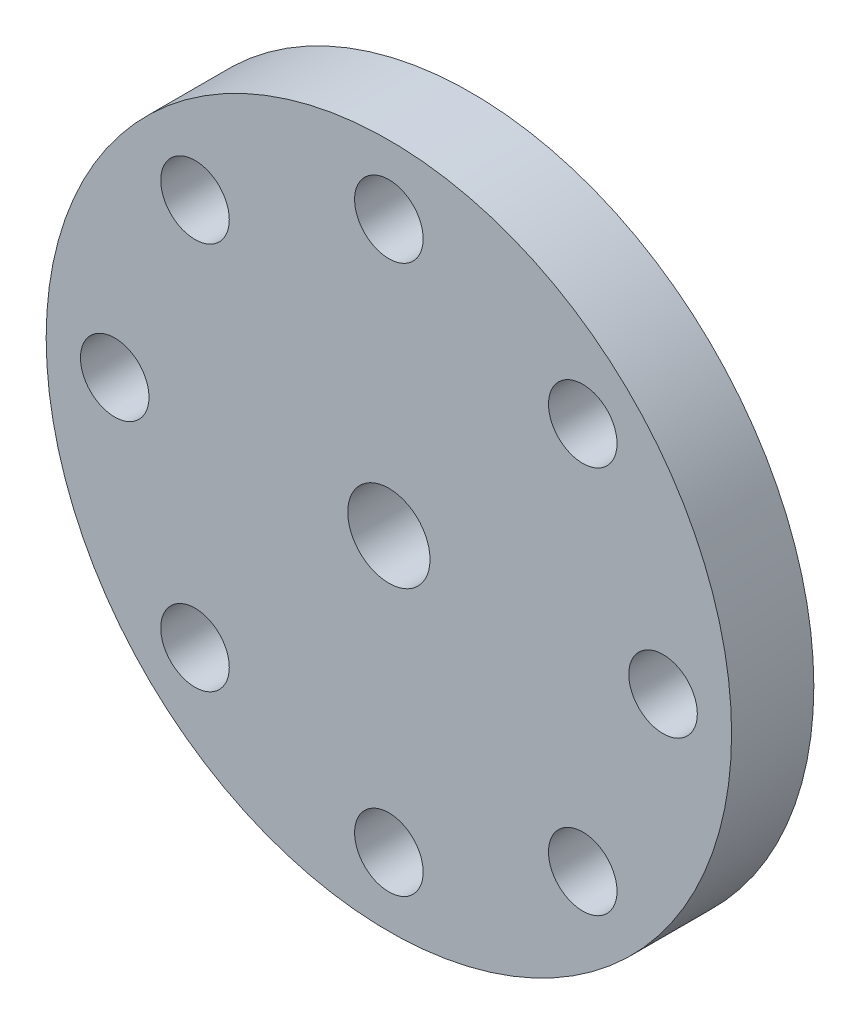
ISO-10303-21;
HEADER;
FILE_DESCRIPTION(('STEP AP214'),'2;1');
FILE_NAME('part.step','',(''),(''),'','','');
FILE_SCHEMA(('AUTOMOTIVE_DESIGN { 1 0 10303 214 1 1 1 1 }'));
ENDSEC;
DATA;
#1=APPLICATION_CONTEXT('core data for automotive mechanical design processes');
#2=APPLICATION_PROTOCOL_DEFINITION('international standard','automotive_design',2000,#1);
#3=PRODUCT_CONTEXT('',#1,'mechanical');
#4=PRODUCT('Part','Part','',(#3));
#5=PRODUCT_RELATED_PRODUCT_CATEGORY('part','',(#4));
#6=PRODUCT_DEFINITION_FORMATION('','',#4);
#7=PRODUCT_DEFINITION_CONTEXT('part definition',#1,'design');
#8=PRODUCT_DEFINITION('design','',#6,#7);
#9=PRODUCT_DEFINITION_SHAPE('','',#8);
#10=(LENGTH_UNIT() NAMED_UNIT(*) SI_UNIT(.MILLI.,.METRE.));
#11=(NAMED_UNIT(*) PLANE_ANGLE_UNIT() SI_UNIT($,.RADIAN.));
#12=(NAMED_UNIT(*) SI_UNIT($,.STERADIAN.) SOLID_ANGLE_UNIT());
#13=UNCERTAINTY_MEASURE_WITH_UNIT(LENGTH_MEASURE(1.E-05),#10,'distance_accuracy_value','');
#14=(GEOMETRIC_REPRESENTATION_CONTEXT(3) GLOBAL_UNCERTAINTY_ASSIGNED_CONTEXT((#13)) GLOBAL_UNIT_ASSIGNED_CONTEXT((#10,
#11,#12)) REPRESENTATION_CONTEXT('',''));
#15=CARTESIAN_POINT('',(0.,0.,0.));
#16=DIRECTION('',(0.,0.,1.));
#17=DIRECTION('',(1.,0.,0.));
#18=AXIS2_PLACEMENT_3D('',#15,#16,#17);
#19=CARTESIAN_POINT('',(0.,0.,3.));
#20=DIRECTION('',(0.,0.,-1.));
#21=DIRECTION('',(-1.,0.,0.));
#22=AXIS2_PLACEMENT_3D('',#19,#20,#21);
#23=CYLINDRICAL_SURFACE('',#22,1.5);
#24=CARTESIAN_POINT('',(0.,0.,3.));
#25=DIRECTION('',(0.,0.,1.));
#26=DIRECTION('',(1.,0.,0.));
#27=AXIS2_PLACEMENT_3D('',#24,#25,#26);
#28=CIRCLE('',#27,1.5);
#29=CARTESIAN_POINT('',(1.5,0.,3.));
#30=VERTEX_POINT('',#29);
#31=EDGE_CURVE('E53',#30,#30,#28,.T.);
#32=ORIENTED_EDGE('',*,*,#31,.T.);
#33=EDGE_LOOP('',(#32));
#34=FACE_BOUND('',#33,.T.);
#35=CARTESIAN_POINT('',(0.,0.,0.5));
#36=DIRECTION('',(0.,0.,-1.));
#37=DIRECTION('',(-1.,0.,0.));
#38=AXIS2_PLACEMENT_3D('',#35,#36,#37);
#39=CIRCLE('',#38,1.5);
#40=CARTESIAN_POINT('',(-1.5,0.,0.5));
#41=VERTEX_POINT('',#40);
#42=EDGE_CURVE('E104',#41,#41,#39,.T.);
#43=ORIENTED_EDGE('',*,*,#42,.T.);
#44=EDGE_LOOP('',(#43));
#45=FACE_BOUND('',#44,.T.);
#46=ADVANCED_FACE('F37',(#34,#45),#23,.F.);
#47=CARTESIAN_POINT('',(0.,0.,3.));
#48=DIRECTION('',(0.,0.,1.));
#49=DIRECTION('',(1.,0.,0.));
#50=AXIS2_PLACEMENT_3D('',#47,#48,#49);
#51=PLANE('',#50);
#52=CARTESIAN_POINT('',(-10.,1.04744440165294E-13,3.));
#53=DIRECTION('',(0.,0.,1.));
#54=DIRECTION('',(1.,0.,0.));
#55=AXIS2_PLACEMENT_3D('',#52,#53,#54);
#56=CIRCLE('',#55,1.25);
#57=CARTESIAN_POINT('',(-8.75,1.04744440165294E-13,3.));
#58=VERTEX_POINT('',#57);
#59=EDGE_CURVE('E86',#58,#58,#56,.T.);
#60=ORIENTED_EDGE('',*,*,#59,.F.);
#61=EDGE_LOOP('',(#60));
#62=FACE_BOUND('',#61,.T.);
#63=CARTESIAN_POINT('',(0.,-10.,3.));
#64=DIRECTION('',(0.,0.,1.));
#65=DIRECTION('',(1.,0.,0.));
#66=AXIS2_PLACEMENT_3D('',#63,#64,#65);
#67=CIRCLE('',#66,1.25);
#68=CARTESIAN_POINT('',(1.24999999999993,-10.,3.));
#69=VERTEX_POINT('',#68);
#70=EDGE_CURVE('E74',#69,#69,#67,.T.);
#71=ORIENTED_EDGE('',*,*,#70,.F.);
#72=EDGE_LOOP('',(#71));
#73=FACE_BOUND('',#72,.T.);
#74=CARTESIAN_POINT('',(10.,0.,3.));
#75=DIRECTION('',(0.,0.,1.));
#76=DIRECTION('',(1.,0.,0.));
#77=AXIS2_PLACEMENT_3D('',#74,#75,#76);
#78=CIRCLE('',#77,1.25);
#79=CARTESIAN_POINT('',(11.25,0.,3.));
#80=VERTEX_POINT('',#79);
#81=EDGE_CURVE('E62',#80,#80,#78,.T.);
#82=ORIENTED_EDGE('',*,*,#81,.F.);
#83=EDGE_LOOP('',(#82));
#84=FACE_BOUND('',#83,.T.);
#85=ORIENTED_EDGE('',*,*,#31,.F.);
#86=EDGE_LOOP('',(#85));
#87=FACE_BOUND('',#86,.T.);
#88=CARTESIAN_POINT('',(0.,0.,3.));
#89=DIRECTION('',(0.,0.,1.));
#90=DIRECTION('',(1.,0.,0.));
#91=AXIS2_PLACEMENT_3D('',#88,#89,#90);
#92=CIRCLE('',#91,12.5);
#93=CARTESIAN_POINT('',(12.5,0.,3.));
#94=VERTEX_POINT('',#93);
#95=EDGE_CURVE('E10',#94,#94,#92,.T.);
#96=ORIENTED_EDGE('',*,*,#95,.T.);
#97=EDGE_LOOP('',(#96));
#98=FACE_BOUND('',#97,.T.);
#99=CARTESIAN_POINT('',(0.,10.,3.));
#100=DIRECTION('',(0.,0.,1.));
#101=DIRECTION('',(1.,0.,0.));
#102=AXIS2_PLACEMENT_3D('',#99,#100,#101);
#103=CIRCLE('',#102,1.25);
#104=CARTESIAN_POINT('',(1.25,10.,3.));
#105=VERTEX_POINT('',#104);
#106=EDGE_CURVE('E48',#105,#105,#103,.T.);
#107=ORIENTED_EDGE('',*,*,#106,.F.);
#108=EDGE_LOOP('',(#107));
#109=FACE_BOUND('',#108,.T.);
#110=CARTESIAN_POINT('',(7.07106781186549,7.07106781186546,3.));
#111=DIRECTION('',(0.,0.,1.));
#112=DIRECTION('',(1.,0.,0.));
#113=AXIS2_PLACEMENT_3D('',#110,#111,#112);
#114=CIRCLE('',#113,1.25);
#115=CARTESIAN_POINT('',(8.32106781186549,7.07106781186546,3.));
#116=VERTEX_POINT('',#115);
#117=EDGE_CURVE('E58',#116,#116,#114,.T.);
#118=ORIENTED_EDGE('',*,*,#117,.F.);
#119=EDGE_LOOP('',(#118));
#120=FACE_BOUND('',#119,.T.);
#121=CARTESIAN_POINT('',(7.07106781186544,-7.07106781186551,3.));
#122=DIRECTION('',(0.,0.,1.));
#123=DIRECTION('',(1.,0.,0.));
#124=AXIS2_PLACEMENT_3D('',#121,#122,#123);
#125=CIRCLE('',#124,1.25);
#126=CARTESIAN_POINT('',(8.32106781186544,-7.07106781186551,3.));
#127=VERTEX_POINT('',#126);
#128=EDGE_CURVE('E68',#127,#127,#125,.T.);
#129=ORIENTED_EDGE('',*,*,#128,.F.);
#130=EDGE_LOOP('',(#129));
#131=FACE_BOUND('',#130,.T.);
#132=CARTESIAN_POINT('',(-7.07106781186554,-7.07106781186541,3.));
#133=DIRECTION('',(0.,0.,1.));
#134=DIRECTION('',(1.,0.,0.));
#135=AXIS2_PLACEMENT_3D('',#132,#133,#134);
#136=CIRCLE('',#135,1.25);
#137=CARTESIAN_POINT('',(-5.82106781186554,-7.07106781186541,3.));
#138=VERTEX_POINT('',#137);
#139=EDGE_CURVE('E80',#138,#138,#136,.T.);
#140=ORIENTED_EDGE('',*,*,#139,.F.);
#141=EDGE_LOOP('',(#140));
#142=FACE_BOUND('',#141,.T.);
#143=CARTESIAN_POINT('',(-7.07106781186539,7.07106781186556,3.));
#144=DIRECTION('',(0.,0.,1.));
#145=DIRECTION('',(1.,0.,0.));
#146=AXIS2_PLACEMENT_3D('',#143,#144,#145);
#147=CIRCLE('',#146,1.25);
#148=CARTESIAN_POINT('',(-5.82106781186539,7.07106781186556,3.));
#149=VERTEX_POINT('',#148);
#150=EDGE_CURVE('E92',#149,#149,#147,.T.);
#151=ORIENTED_EDGE('',*,*,#150,.F.);
#152=EDGE_LOOP('',(#151));
#153=FACE_BOUND('',#152,.T.);
#154=ADVANCED_FACE('F127',(#62,#73,#84,#87,#98,#109,#120,#131,#142,#153),#51,.T.);
#155=CARTESIAN_POINT('',(0.,0.,0.));
#156=DIRECTION('',(0.,0.,1.));
#157=DIRECTION('',(1.,0.,0.));
#158=AXIS2_PLACEMENT_3D('',#155,#156,#157);
#159=PLANE('',#158);
#160=CARTESIAN_POINT('',(0.,0.,0.));
#161=DIRECTION('',(0.,0.,-1.));
#162=DIRECTION('',(-1.,0.,0.));
#163=AXIS2_PLACEMENT_3D('',#160,#161,#162);
#164=CIRCLE('',#163,3.5);
#165=CARTESIAN_POINT('',(-3.5,0.,0.));
#166=VERTEX_POINT('',#165);
#167=EDGE_CURVE('E101',#166,#166,#164,.T.);
#168=ORIENTED_EDGE('',*,*,#167,.F.);
#169=EDGE_LOOP('',(#168));
#170=FACE_BOUND('',#169,.T.);
#171=CARTESIAN_POINT('',(0.,0.,0.));
#172=DIRECTION('',(0.,0.,1.));
#173=DIRECTION('',(1.,0.,0.));
#174=AXIS2_PLACEMENT_3D('',#171,#172,#173);
#175=CIRCLE('',#174,12.5);
#176=CARTESIAN_POINT('',(12.5,0.,0.));
#177=VERTEX_POINT('',#176);
#178=EDGE_CURVE('E41',#177,#177,#175,.T.);
#179=ORIENTED_EDGE('',*,*,#178,.F.);
#180=EDGE_LOOP('',(#179));
#181=FACE_BOUND('',#180,.T.);
#182=CARTESIAN_POINT('',(0.,10.,0.));
#183=DIRECTION('',(0.,0.,1.));
#184=DIRECTION('',(1.,0.,0.));
#185=AXIS2_PLACEMENT_3D('',#182,#183,#184);
#186=CIRCLE('',#185,1.25);
#187=CARTESIAN_POINT('',(1.25,10.,0.));
#188=VERTEX_POINT('',#187);
#189=EDGE_CURVE('E50',#188,#188,#186,.T.);
#190=ORIENTED_EDGE('',*,*,#189,.T.);
#191=EDGE_LOOP('',(#190));
#192=FACE_BOUND('',#191,.T.);
#193=CARTESIAN_POINT('',(7.07106781186549,7.07106781186546,0.));
#194=DIRECTION('',(0.,0.,1.));
#195=DIRECTION('',(1.,0.,0.));
#196=AXIS2_PLACEMENT_3D('',#193,#194,#195);
#197=CIRCLE('',#196,1.25);
#198=CARTESIAN_POINT('',(8.32106781186549,7.07106781186546,0.));
#199=VERTEX_POINT('',#198);
#200=EDGE_CURVE('E59',#199,#199,#197,.T.);
#201=ORIENTED_EDGE('',*,*,#200,.T.);
#202=EDGE_LOOP('',(#201));
#203=FACE_BOUND('',#202,.T.);
#204=CARTESIAN_POINT('',(10.,0.,0.));
#205=DIRECTION('',(0.,0.,1.));
#206=DIRECTION('',(1.,0.,0.));
#207=AXIS2_PLACEMENT_3D('',#204,#205,#206);
#208=CIRCLE('',#207,1.25);
#209=CARTESIAN_POINT('',(11.25,0.,0.));
#210=VERTEX_POINT('',#209);
#211=EDGE_CURVE('E65',#210,#210,#208,.T.);
#212=ORIENTED_EDGE('',*,*,#211,.T.);
#213=EDGE_LOOP('',(#212));
#214=FACE_BOUND('',#213,.T.);
#215=CARTESIAN_POINT('',(7.07106781186544,-7.07106781186551,0.));
#216=DIRECTION('',(0.,0.,1.));
#217=DIRECTION('',(1.,0.,0.));
#218=AXIS2_PLACEMENT_3D('',#215,#216,#217);
#219=CIRCLE('',#218,1.25);
#220=CARTESIAN_POINT('',(8.32106781186544,-7.07106781186551,0.));
#221=VERTEX_POINT('',#220);
#222=EDGE_CURVE('E71',#221,#221,#219,.T.);
#223=ORIENTED_EDGE('',*,*,#222,.T.);
#224=EDGE_LOOP('',(#223));
#225=FACE_BOUND('',#224,.T.);
#226=CARTESIAN_POINT('',(0.,-10.,0.));
#227=DIRECTION('',(0.,0.,1.));
#228=DIRECTION('',(1.,0.,0.));
#229=AXIS2_PLACEMENT_3D('',#226,#227,#228);
#230=CIRCLE('',#229,1.25);
#231=CARTESIAN_POINT('',(1.24999999999993,-10.,0.));
#232=VERTEX_POINT('',#231);
#233=EDGE_CURVE('E77',#232,#232,#230,.T.);
#234=ORIENTED_EDGE('',*,*,#233,.T.);
#235=EDGE_LOOP('',(#234));
#236=FACE_BOUND('',#235,.T.);
#237=CARTESIAN_POINT('',(-7.07106781186554,-7.07106781186541,0.));
#238=DIRECTION('',(0.,0.,1.));
#239=DIRECTION('',(1.,0.,0.));
#240=AXIS2_PLACEMENT_3D('',#237,#238,#239);
#241=CIRCLE('',#240,1.25);
#242=CARTESIAN_POINT('',(-5.82106781186554,-7.07106781186541,0.));
#243=VERTEX_POINT('',#242);
#244=EDGE_CURVE('E83',#243,#243,#241,.T.);
#245=ORIENTED_EDGE('',*,*,#244,.T.);
#246=EDGE_LOOP('',(#245));
#247=FACE_BOUND('',#246,.T.);
#248=CARTESIAN_POINT('',(-10.,1.04744440165294E-13,0.));
#249=DIRECTION('',(0.,0.,1.));
#250=DIRECTION('',(1.,0.,0.));
#251=AXIS2_PLACEMENT_3D('',#248,#249,#250);
#252=CIRCLE('',#251,1.25);
#253=CARTESIAN_POINT('',(-8.75,1.04744440165294E-13,0.));
#254=VERTEX_POINT('',#253);
#255=EDGE_CURVE('E89',#254,#254,#252,.T.);
#256=ORIENTED_EDGE('',*,*,#255,.T.);
#257=EDGE_LOOP('',(#256));
#258=FACE_BOUND('',#257,.T.);
#259=CARTESIAN_POINT('',(-7.07106781186539,7.07106781186556,0.));
#260=DIRECTION('',(0.,0.,1.));
#261=DIRECTION('',(1.,0.,0.));
#262=AXIS2_PLACEMENT_3D('',#259,#260,#261);
#263=CIRCLE('',#262,1.25);
#264=CARTESIAN_POINT('',(-5.82106781186539,7.07106781186556,0.));
#265=VERTEX_POINT('',#264);
#266=EDGE_CURVE('E95',#265,#265,#263,.T.);
#267=ORIENTED_EDGE('',*,*,#266,.T.);
#268=EDGE_LOOP('',(#267));
#269=FACE_BOUND('',#268,.T.);
#270=ADVANCED_FACE('F124',(#170,#181,#192,#203,#214,#225,#236,#247,#258,#269),#159,.F.);
#271=CARTESIAN_POINT('',(0.,0.,3.));
#272=DIRECTION('',(0.,0.,-1.));
#273=DIRECTION('',(-1.,0.,0.));
#274=AXIS2_PLACEMENT_3D('',#271,#272,#273);
#275=CYLINDRICAL_SURFACE('',#274,12.5);
#276=ORIENTED_EDGE('',*,*,#95,.F.);
#277=EDGE_LOOP('',(#276));
#278=FACE_BOUND('',#277,.T.);
#279=ORIENTED_EDGE('',*,*,#178,.T.);
#280=EDGE_LOOP('',(#279));
#281=FACE_BOUND('',#280,.T.);
#282=ADVANCED_FACE('F39',(#278,#281),#275,.T.);
#283=CARTESIAN_POINT('',(0.,10.,3.));
#284=DIRECTION('',(0.,0.,-1.));
#285=DIRECTION('',(-1.,0.,0.));
#286=AXIS2_PLACEMENT_3D('',#283,#284,#285);
#287=CYLINDRICAL_SURFACE('',#286,1.25);
#288=ORIENTED_EDGE('',*,*,#106,.T.);
#289=EDGE_LOOP('',(#288));
#290=FACE_BOUND('',#289,.T.);
#291=ORIENTED_EDGE('',*,*,#189,.F.);
#292=EDGE_LOOP('',(#291));
#293=FACE_BOUND('',#292,.T.);
#294=ADVANCED_FACE('F168',(#290,#293),#287,.F.);
#295=CARTESIAN_POINT('',(7.07106781186549,7.07106781186546,3.));
#296=DIRECTION('',(0.,0.,-1.));
#297=DIRECTION('',(-1.,0.,0.));
#298=AXIS2_PLACEMENT_3D('',#295,#296,#297);
#299=CYLINDRICAL_SURFACE('',#298,1.25);
#300=ORIENTED_EDGE('',*,*,#117,.T.);
#301=EDGE_LOOP('',(#300));
#302=FACE_BOUND('',#301,.T.);
#303=ORIENTED_EDGE('',*,*,#200,.F.);
#304=EDGE_LOOP('',(#303));
#305=FACE_BOUND('',#304,.T.);
#306=ADVANCED_FACE('F166',(#302,#305),#299,.F.);
#307=CARTESIAN_POINT('',(10.,0.,3.));
#308=DIRECTION('',(0.,0.,-1.));
#309=DIRECTION('',(-1.,0.,0.));
#310=AXIS2_PLACEMENT_3D('',#307,#308,#309);
#311=CYLINDRICAL_SURFACE('',#310,1.25);
#312=ORIENTED_EDGE('',*,*,#81,.T.);
#313=EDGE_LOOP('',(#312));
#314=FACE_BOUND('',#313,.T.);
#315=ORIENTED_EDGE('',*,*,#211,.F.);
#316=EDGE_LOOP('',(#315));
#317=FACE_BOUND('',#316,.T.);
#318=ADVANCED_FACE('F175',(#314,#317),#311,.F.);
#319=CARTESIAN_POINT('',(7.07106781186544,-7.07106781186551,3.));
#320=DIRECTION('',(0.,0.,-1.));
#321=DIRECTION('',(-1.,0.,0.));
#322=AXIS2_PLACEMENT_3D('',#319,#320,#321);
#323=CYLINDRICAL_SURFACE('',#322,1.25);
#324=ORIENTED_EDGE('',*,*,#128,.T.);
#325=EDGE_LOOP('',(#324));
#326=FACE_BOUND('',#325,.T.);
#327=ORIENTED_EDGE('',*,*,#222,.F.);
#328=EDGE_LOOP('',(#327));
#329=FACE_BOUND('',#328,.T.);
#330=ADVANCED_FACE('F197',(#326,#329),#323,.F.);
#331=CARTESIAN_POINT('',(0.,-10.,3.));
#332=DIRECTION('',(0.,0.,-1.));
#333=DIRECTION('',(-1.,0.,0.));
#334=AXIS2_PLACEMENT_3D('',#331,#332,#333);
#335=CYLINDRICAL_SURFACE('',#334,1.25);
#336=ORIENTED_EDGE('',*,*,#70,.T.);
#337=EDGE_LOOP('',(#336));
#338=FACE_BOUND('',#337,.T.);
#339=ORIENTED_EDGE('',*,*,#233,.F.);
#340=EDGE_LOOP('',(#339));
#341=FACE_BOUND('',#340,.T.);
#342=ADVANCED_FACE('F192',(#338,#341),#335,.F.);
#343=CARTESIAN_POINT('',(-7.07106781186554,-7.07106781186541,3.));
#344=DIRECTION('',(0.,0.,-1.));
#345=DIRECTION('',(-1.,0.,0.));
#346=AXIS2_PLACEMENT_3D('',#343,#344,#345);
#347=CYLINDRICAL_SURFACE('',#346,1.25);
#348=ORIENTED_EDGE('',*,*,#139,.T.);
#349=EDGE_LOOP('',(#348));
#350=FACE_BOUND('',#349,.T.);
#351=ORIENTED_EDGE('',*,*,#244,.F.);
#352=EDGE_LOOP('',(#351));
#353=FACE_BOUND('',#352,.T.);
#354=ADVANCED_FACE('F154',(#350,#353),#347,.F.);
#355=CARTESIAN_POINT('',(-10.,1.04744440165294E-13,3.));
#356=DIRECTION('',(0.,0.,-1.));
#357=DIRECTION('',(-1.,0.,0.));
#358=AXIS2_PLACEMENT_3D('',#355,#356,#357);
#359=CYLINDRICAL_SURFACE('',#358,1.25);
#360=ORIENTED_EDGE('',*,*,#59,.T.);
#361=EDGE_LOOP('',(#360));
#362=FACE_BOUND('',#361,.T.);
#363=ORIENTED_EDGE('',*,*,#255,.F.);
#364=EDGE_LOOP('',(#363));
#365=FACE_BOUND('',#364,.T.);
#366=ADVANCED_FACE('F147',(#362,#365),#359,.F.);
#367=CARTESIAN_POINT('',(-7.07106781186539,7.07106781186556,3.));
#368=DIRECTION('',(0.,0.,-1.));
#369=DIRECTION('',(-1.,0.,0.));
#370=AXIS2_PLACEMENT_3D('',#367,#368,#369);
#371=CYLINDRICAL_SURFACE('',#370,1.25);
#372=ORIENTED_EDGE('',*,*,#150,.T.);
#373=EDGE_LOOP('',(#372));
#374=FACE_BOUND('',#373,.T.);
#375=ORIENTED_EDGE('',*,*,#266,.F.);
#376=EDGE_LOOP('',(#375));
#377=FACE_BOUND('',#376,.T.);
#378=ADVANCED_FACE('F120',(#374,#377),#371,.F.);
#379=CARTESIAN_POINT('',(0.,0.,0.5));
#380=DIRECTION('',(0.,0.,-1.));
#381=DIRECTION('',(-1.,0.,0.));
#382=AXIS2_PLACEMENT_3D('',#379,#380,#381);
#383=CYLINDRICAL_SURFACE('',#382,3.5);
#384=CARTESIAN_POINT('',(0.,0.,0.5));
#385=DIRECTION('',(0.,0.,-1.));
#386=DIRECTION('',(-1.,0.,0.));
#387=AXIS2_PLACEMENT_3D('',#384,#385,#386);
#388=CIRCLE('',#387,3.5);
#389=CARTESIAN_POINT('',(-3.5,0.,0.5));
#390=VERTEX_POINT('',#389);
#391=EDGE_CURVE('E98',#390,#390,#388,.T.);
#392=ORIENTED_EDGE('',*,*,#391,.F.);
#393=EDGE_LOOP('',(#392));
#394=FACE_BOUND('',#393,.T.);
#395=ORIENTED_EDGE('',*,*,#167,.T.);
#396=EDGE_LOOP('',(#395));
#397=FACE_BOUND('',#396,.T.);
#398=ADVANCED_FACE('F114',(#394,#397),#383,.F.);
#399=CARTESIAN_POINT('',(0.,0.,0.5));
#400=DIRECTION('',(0.,0.,-1.));
#401=DIRECTION('',(-1.,0.,0.));
#402=AXIS2_PLACEMENT_3D('',#399,#400,#401);
#403=PLANE('',#402);
#404=ORIENTED_EDGE('',*,*,#42,.F.);
#405=EDGE_LOOP('',(#404));
#406=FACE_BOUND('',#405,.T.);
#407=ORIENTED_EDGE('',*,*,#391,.T.);
#408=EDGE_LOOP('',(#407));
#409=FACE_BOUND('',#408,.T.);
#410=ADVANCED_FACE('F111',(#406,#409),#403,.T.);
#411=CLOSED_SHELL('',(#46,#154,#270,#282,#294,#306,#318,#330,#342,#354,#366,#378,#398,#410));
#412=MANIFOLD_SOLID_BREP('B2',#411);
#413=ADVANCED_BREP_SHAPE_REPRESENTATION('',(#18,#412),#14);
#414=SHAPE_DEFINITION_REPRESENTATION(#9,#413);
ENDSEC;
END-ISO-10303-21;
